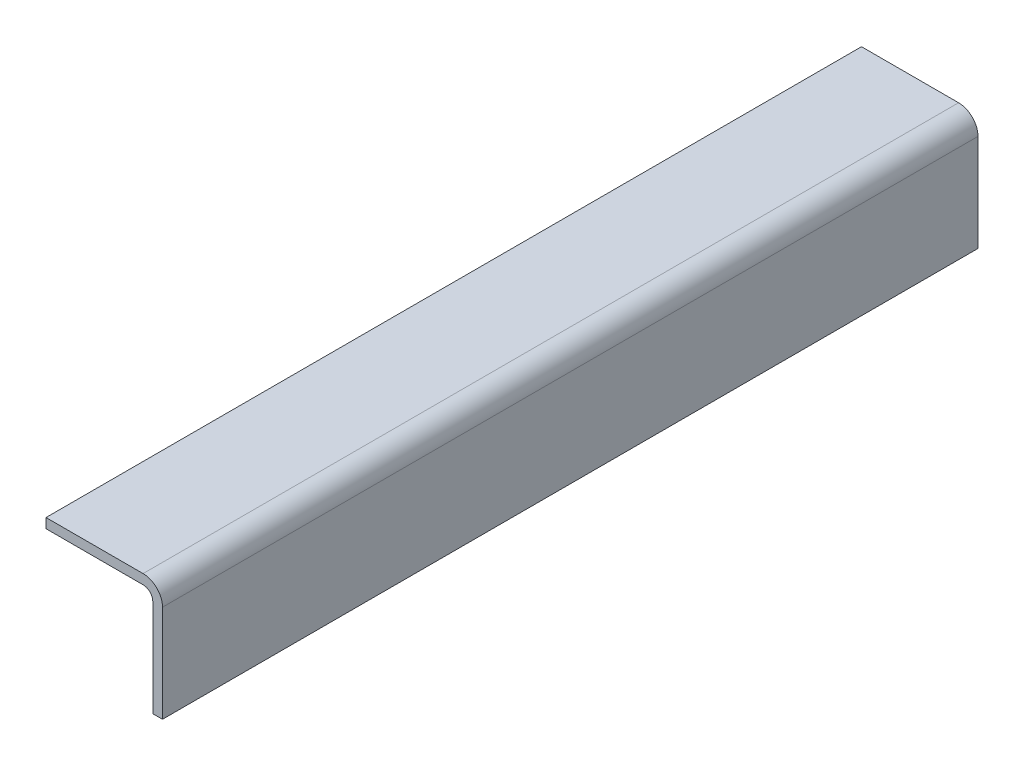
ISO-10303-21;
HEADER;
FILE_DESCRIPTION(('STEP AP214'),'2;1');
FILE_NAME('part.step','',(''),(''),'','','');
FILE_SCHEMA(('AUTOMOTIVE_DESIGN { 1 0 10303 214 1 1 1 1 }'));
ENDSEC;
DATA;
#1=APPLICATION_CONTEXT('core data for automotive mechanical design processes');
#2=APPLICATION_PROTOCOL_DEFINITION('international standard','automotive_design',2000,#1);
#3=PRODUCT_CONTEXT('',#1,'mechanical');
#4=PRODUCT('Part','Part','',(#3));
#5=PRODUCT_RELATED_PRODUCT_CATEGORY('part','',(#4));
#6=PRODUCT_DEFINITION_FORMATION('','',#4);
#7=PRODUCT_DEFINITION_CONTEXT('part definition',#1,'design');
#8=PRODUCT_DEFINITION('design','',#6,#7);
#9=PRODUCT_DEFINITION_SHAPE('','',#8);
#10=(LENGTH_UNIT() NAMED_UNIT(*) SI_UNIT(.MILLI.,.METRE.));
#11=(NAMED_UNIT(*) PLANE_ANGLE_UNIT() SI_UNIT($,.RADIAN.));
#12=(NAMED_UNIT(*) SI_UNIT($,.STERADIAN.) SOLID_ANGLE_UNIT());
#13=UNCERTAINTY_MEASURE_WITH_UNIT(LENGTH_MEASURE(1.E-05),#10,'distance_accuracy_value','');
#14=(GEOMETRIC_REPRESENTATION_CONTEXT(3) GLOBAL_UNCERTAINTY_ASSIGNED_CONTEXT((#13)) GLOBAL_UNIT_ASSIGNED_CONTEXT((#10,
#11,#12)) REPRESENTATION_CONTEXT('',''));
#15=CARTESIAN_POINT('',(0.,0.,0.));
#16=DIRECTION('',(0.,0.,1.));
#17=DIRECTION('',(1.,0.,0.));
#18=AXIS2_PLACEMENT_3D('',#15,#16,#17);
#19=CARTESIAN_POINT('',(0.,38.1,133.35));
#20=DIRECTION('',(0.,1.,0.));
#21=DIRECTION('',(0.,0.,1.));
#22=AXIS2_PLACEMENT_3D('',#19,#20,#21);
#23=PLANE('',#22);
#24=DIRECTION('',(1.,0.,0.));
#25=VECTOR('',#24,1.);
#26=CARTESIAN_POINT('',(0.,38.1,133.35));
#27=LINE('',#26,#25);
#28=CARTESIAN_POINT('',(-38.1,38.1,133.35));
#29=VERTEX_POINT('',#28);
#30=CARTESIAN_POINT('',(-6.35,38.1,133.35));
#31=VERTEX_POINT('',#30);
#32=EDGE_CURVE('E104',#29,#31,#27,.T.);
#33=ORIENTED_EDGE('',*,*,#32,.T.);
#34=DIRECTION('',(0.,0.,-1.));
#35=VECTOR('',#34,1.);
#36=CARTESIAN_POINT('',(-6.35,38.1,133.35));
#37=LINE('',#36,#35);
#38=CARTESIAN_POINT('',(-6.35,38.1,-133.35));
#39=VERTEX_POINT('',#38);
#40=EDGE_CURVE('E163',#31,#39,#37,.T.);
#41=ORIENTED_EDGE('',*,*,#40,.T.);
#42=DIRECTION('',(1.,0.,0.));
#43=VECTOR('',#42,1.);
#44=CARTESIAN_POINT('',(0.,38.1,-133.35));
#45=LINE('',#44,#43);
#46=CARTESIAN_POINT('',(-38.1,38.1,-133.35));
#47=VERTEX_POINT('',#46);
#48=EDGE_CURVE('E106',#47,#39,#45,.T.);
#49=ORIENTED_EDGE('',*,*,#48,.F.);
#50=DIRECTION('',(0.,0.,-1.));
#51=VECTOR('',#50,1.);
#52=CARTESIAN_POINT('',(-38.1,38.1,133.35));
#53=LINE('',#52,#51);
#54=EDGE_CURVE('E101',#29,#47,#53,.T.);
#55=ORIENTED_EDGE('',*,*,#54,.F.);
#56=EDGE_LOOP('',(#33,#41,#49,#55));
#57=FACE_BOUND('',#56,.T.);
#58=ADVANCED_FACE('F38',(#57),#23,.T.);
#59=CARTESIAN_POINT('',(-38.1,0.,133.35));
#60=DIRECTION('',(-1.,0.,0.));
#61=DIRECTION('',(0.,0.,1.));
#62=AXIS2_PLACEMENT_3D('',#59,#60,#61);
#63=PLANE('',#62);
#64=DIRECTION('',(0.,1.,0.));
#65=VECTOR('',#64,1.);
#66=CARTESIAN_POINT('',(-38.1,0.,-133.35));
#67=LINE('',#66,#65);
#68=CARTESIAN_POINT('',(-38.1,34.925,-133.35));
#69=VERTEX_POINT('',#68);
#70=EDGE_CURVE('E139',#69,#47,#67,.T.);
#71=ORIENTED_EDGE('',*,*,#70,.F.);
#72=DIRECTION('',(0.,0.,-1.));
#73=VECTOR('',#72,1.);
#74=CARTESIAN_POINT('',(-38.1,34.925,133.35));
#75=LINE('',#74,#73);
#76=CARTESIAN_POINT('',(-38.1,34.925,133.35));
#77=VERTEX_POINT('',#76);
#78=EDGE_CURVE('E112',#77,#69,#75,.T.);
#79=ORIENTED_EDGE('',*,*,#78,.F.);
#80=DIRECTION('',(0.,1.,0.));
#81=VECTOR('',#80,1.);
#82=CARTESIAN_POINT('',(-38.1,0.,133.35));
#83=LINE('',#82,#81);
#84=EDGE_CURVE('E118',#77,#29,#83,.T.);
#85=ORIENTED_EDGE('',*,*,#84,.T.);
#86=ORIENTED_EDGE('',*,*,#54,.T.);
#87=EDGE_LOOP('',(#71,#79,#85,#86));
#88=FACE_BOUND('',#87,.T.);
#89=ADVANCED_FACE('F123',(#88),#63,.T.);
#90=CARTESIAN_POINT('',(0.,34.925,133.35));
#91=DIRECTION('',(0.,-1.,0.));
#92=DIRECTION('',(0.,0.,-1.));
#93=AXIS2_PLACEMENT_3D('',#90,#91,#92);
#94=PLANE('',#93);
#95=DIRECTION('',(-1.,0.,0.));
#96=VECTOR('',#95,1.);
#97=CARTESIAN_POINT('',(0.,34.925,-133.35));
#98=LINE('',#97,#96);
#99=CARTESIAN_POINT('',(-6.35,34.925,-133.35));
#100=VERTEX_POINT('',#99);
#101=EDGE_CURVE('E141',#100,#69,#98,.T.);
#102=ORIENTED_EDGE('',*,*,#101,.F.);
#103=DIRECTION('',(0.,0.,-1.));
#104=VECTOR('',#103,1.);
#105=CARTESIAN_POINT('',(-6.35,34.925,133.35));
#106=LINE('',#105,#104);
#107=CARTESIAN_POINT('',(-6.35,34.925,133.35));
#108=VERTEX_POINT('',#107);
#109=EDGE_CURVE('E157',#100,#108,#106,.F.);
#110=ORIENTED_EDGE('',*,*,#109,.T.);
#111=DIRECTION('',(-1.,0.,0.));
#112=VECTOR('',#111,1.);
#113=CARTESIAN_POINT('',(0.,34.925,133.35));
#114=LINE('',#113,#112);
#115=EDGE_CURVE('E125',#108,#77,#114,.T.);
#116=ORIENTED_EDGE('',*,*,#115,.T.);
#117=ORIENTED_EDGE('',*,*,#78,.T.);
#118=EDGE_LOOP('',(#102,#110,#116,#117));
#119=FACE_BOUND('',#118,.T.);
#120=ADVANCED_FACE('F170',(#119),#94,.T.);
#121=CARTESIAN_POINT('',(-3.175,0.,133.35));
#122=DIRECTION('',(-1.,0.,0.));
#123=DIRECTION('',(0.,-1.,0.));
#124=AXIS2_PLACEMENT_3D('',#121,#122,#123);
#125=PLANE('',#124);
#126=DIRECTION('',(0.,1.,0.));
#127=VECTOR('',#126,1.);
#128=CARTESIAN_POINT('',(-3.175,0.,133.35));
#129=LINE('',#128,#127);
#130=CARTESIAN_POINT('',(-3.175,0.,133.35));
#131=VERTEX_POINT('',#130);
#132=CARTESIAN_POINT('',(-3.175,31.75,133.35));
#133=VERTEX_POINT('',#132);
#134=EDGE_CURVE('E127',#131,#133,#129,.T.);
#135=ORIENTED_EDGE('',*,*,#134,.T.);
#136=DIRECTION('',(0.,0.,-1.));
#137=VECTOR('',#136,1.);
#138=CARTESIAN_POINT('',(-3.175,31.75,-133.35));
#139=LINE('',#138,#137);
#140=CARTESIAN_POINT('',(-3.175,31.75,-133.35));
#141=VERTEX_POINT('',#140);
#142=EDGE_CURVE('E111',#133,#141,#139,.T.);
#143=ORIENTED_EDGE('',*,*,#142,.T.);
#144=DIRECTION('',(0.,1.,0.));
#145=VECTOR('',#144,1.);
#146=CARTESIAN_POINT('',(-3.175,0.,-133.35));
#147=LINE('',#146,#145);
#148=CARTESIAN_POINT('',(-3.175,0.,-133.35));
#149=VERTEX_POINT('',#148);
#150=EDGE_CURVE('E143',#149,#141,#147,.T.);
#151=ORIENTED_EDGE('',*,*,#150,.F.);
#152=DIRECTION('',(0.,0.,-1.));
#153=VECTOR('',#152,1.);
#154=CARTESIAN_POINT('',(-3.175,0.,133.35));
#155=LINE('',#154,#153);
#156=EDGE_CURVE('E152',#131,#149,#155,.T.);
#157=ORIENTED_EDGE('',*,*,#156,.F.);
#158=EDGE_LOOP('',(#135,#143,#151,#157));
#159=FACE_BOUND('',#158,.T.);
#160=ADVANCED_FACE('F178',(#159),#125,.T.);
#161=CARTESIAN_POINT('',(0.,0.,133.35));
#162=DIRECTION('',(0.,-1.,0.));
#163=DIRECTION('',(1.,0.,0.));
#164=AXIS2_PLACEMENT_3D('',#161,#162,#163);
#165=PLANE('',#164);
#166=DIRECTION('',(-1.,0.,0.));
#167=VECTOR('',#166,1.);
#168=CARTESIAN_POINT('',(0.,0.,-133.35));
#169=LINE('',#168,#167);
#170=CARTESIAN_POINT('',(0.,0.,-133.35));
#171=VERTEX_POINT('',#170);
#172=EDGE_CURVE('E146',#171,#149,#169,.T.);
#173=ORIENTED_EDGE('',*,*,#172,.F.);
#174=DIRECTION('',(0.,0.,-1.));
#175=VECTOR('',#174,1.);
#176=CARTESIAN_POINT('',(0.,0.,133.35));
#177=LINE('',#176,#175);
#178=CARTESIAN_POINT('',(0.,0.,133.35));
#179=VERTEX_POINT('',#178);
#180=EDGE_CURVE('E137',#179,#171,#177,.T.);
#181=ORIENTED_EDGE('',*,*,#180,.F.);
#182=DIRECTION('',(-1.,0.,0.));
#183=VECTOR('',#182,1.);
#184=CARTESIAN_POINT('',(0.,0.,133.35));
#185=LINE('',#184,#183);
#186=EDGE_CURVE('E132',#179,#131,#185,.T.);
#187=ORIENTED_EDGE('',*,*,#186,.T.);
#188=ORIENTED_EDGE('',*,*,#156,.T.);
#189=EDGE_LOOP('',(#173,#181,#187,#188));
#190=FACE_BOUND('',#189,.T.);
#191=ADVANCED_FACE('F182',(#190),#165,.T.);
#192=CARTESIAN_POINT('',(0.,0.,133.35));
#193=DIRECTION('',(1.,0.,0.));
#194=DIRECTION('',(0.,1.,0.));
#195=AXIS2_PLACEMENT_3D('',#192,#193,#194);
#196=PLANE('',#195);
#197=DIRECTION('',(0.,-1.,0.));
#198=VECTOR('',#197,1.);
#199=CARTESIAN_POINT('',(0.,0.,-133.35));
#200=LINE('',#199,#198);
#201=CARTESIAN_POINT('',(0.,31.75,-133.35));
#202=VERTEX_POINT('',#201);
#203=EDGE_CURVE('E120',#202,#171,#200,.T.);
#204=ORIENTED_EDGE('',*,*,#203,.F.);
#205=DIRECTION('',(0.,0.,-1.));
#206=VECTOR('',#205,1.);
#207=CARTESIAN_POINT('',(0.,31.75,133.35));
#208=LINE('',#207,#206);
#209=CARTESIAN_POINT('',(0.,31.75,133.35));
#210=VERTEX_POINT('',#209);
#211=EDGE_CURVE('E46',#202,#210,#208,.F.);
#212=ORIENTED_EDGE('',*,*,#211,.T.);
#213=DIRECTION('',(0.,-1.,0.));
#214=VECTOR('',#213,1.);
#215=CARTESIAN_POINT('',(0.,0.,133.35));
#216=LINE('',#215,#214);
#217=EDGE_CURVE('E135',#210,#179,#216,.T.);
#218=ORIENTED_EDGE('',*,*,#217,.T.);
#219=ORIENTED_EDGE('',*,*,#180,.T.);
#220=EDGE_LOOP('',(#204,#212,#218,#219));
#221=FACE_BOUND('',#220,.T.);
#222=ADVANCED_FACE('F201',(#221),#196,.T.);
#223=CARTESIAN_POINT('',(0.,0.,133.35));
#224=DIRECTION('',(0.,0.,1.));
#225=DIRECTION('',(1.,0.,0.));
#226=AXIS2_PLACEMENT_3D('',#223,#224,#225);
#227=PLANE('',#226);
#228=ORIENTED_EDGE('',*,*,#217,.F.);
#229=CARTESIAN_POINT('',(-6.35,31.75,133.35));
#230=DIRECTION('',(0.,0.,1.));
#231=DIRECTION('',(1.,0.,0.));
#232=AXIS2_PLACEMENT_3D('',#229,#230,#231);
#233=CIRCLE('',#232,6.35);
#234=EDGE_CURVE('E11',#210,#31,#233,.T.);
#235=ORIENTED_EDGE('',*,*,#234,.T.);
#236=ORIENTED_EDGE('',*,*,#32,.F.);
#237=ORIENTED_EDGE('',*,*,#84,.F.);
#238=ORIENTED_EDGE('',*,*,#115,.F.);
#239=CARTESIAN_POINT('',(-6.35,31.75,133.35));
#240=DIRECTION('',(0.,0.,1.));
#241=DIRECTION('',(1.,0.,0.));
#242=AXIS2_PLACEMENT_3D('',#239,#240,#241);
#243=CIRCLE('',#242,3.175);
#244=EDGE_CURVE('E161',#108,#133,#243,.F.);
#245=ORIENTED_EDGE('',*,*,#244,.T.);
#246=ORIENTED_EDGE('',*,*,#134,.F.);
#247=ORIENTED_EDGE('',*,*,#186,.F.);
#248=EDGE_LOOP('',(#228,#235,#236,#237,#238,#245,#246,#247));
#249=FACE_BOUND('',#248,.T.);
#250=ADVANCED_FACE('F116',(#249),#227,.T.);
#251=CARTESIAN_POINT('',(0.,0.,-133.35));
#252=DIRECTION('',(0.,0.,1.));
#253=DIRECTION('',(1.,0.,0.));
#254=AXIS2_PLACEMENT_3D('',#251,#252,#253);
#255=PLANE('',#254);
#256=ORIENTED_EDGE('',*,*,#48,.T.);
#257=CARTESIAN_POINT('',(-6.35,31.75,-133.35));
#258=DIRECTION('',(0.,0.,1.));
#259=DIRECTION('',(1.,0.,0.));
#260=AXIS2_PLACEMENT_3D('',#257,#258,#259);
#261=CIRCLE('',#260,6.35);
#262=EDGE_CURVE('E60',#39,#202,#261,.F.);
#263=ORIENTED_EDGE('',*,*,#262,.T.);
#264=ORIENTED_EDGE('',*,*,#203,.T.);
#265=ORIENTED_EDGE('',*,*,#172,.T.);
#266=ORIENTED_EDGE('',*,*,#150,.T.);
#267=CARTESIAN_POINT('',(-6.35,31.75,-133.35));
#268=DIRECTION('',(0.,0.,1.));
#269=DIRECTION('',(1.,0.,0.));
#270=AXIS2_PLACEMENT_3D('',#267,#268,#269);
#271=CIRCLE('',#270,3.175);
#272=EDGE_CURVE('E159',#141,#100,#271,.T.);
#273=ORIENTED_EDGE('',*,*,#272,.T.);
#274=ORIENTED_EDGE('',*,*,#101,.T.);
#275=ORIENTED_EDGE('',*,*,#70,.T.);
#276=EDGE_LOOP('',(#256,#263,#264,#265,#266,#273,#274,#275));
#277=FACE_BOUND('',#276,.T.);
#278=ADVANCED_FACE('F166',(#277),#255,.F.);
#279=CARTESIAN_POINT('',(-6.35,31.75,133.35));
#280=DIRECTION('',(0.,0.,1.));
#281=DIRECTION('',(1.,0.,0.));
#282=AXIS2_PLACEMENT_3D('',#279,#280,#281);
#283=CYLINDRICAL_SURFACE('',#282,3.175);
#284=ORIENTED_EDGE('',*,*,#244,.F.);
#285=ORIENTED_EDGE('',*,*,#109,.F.);
#286=ORIENTED_EDGE('',*,*,#272,.F.);
#287=ORIENTED_EDGE('',*,*,#142,.F.);
#288=EDGE_LOOP('',(#284,#285,#286,#287));
#289=FACE_BOUND('',#288,.T.);
#290=ADVANCED_FACE('F175',(#289),#283,.F.);
#291=CARTESIAN_POINT('',(-6.35,31.75,133.35));
#292=DIRECTION('',(0.,0.,-1.));
#293=DIRECTION('',(-1.,0.,0.));
#294=AXIS2_PLACEMENT_3D('',#291,#292,#293);
#295=CYLINDRICAL_SURFACE('',#294,6.35);
#296=ORIENTED_EDGE('',*,*,#234,.F.);
#297=ORIENTED_EDGE('',*,*,#211,.F.);
#298=ORIENTED_EDGE('',*,*,#262,.F.);
#299=ORIENTED_EDGE('',*,*,#40,.F.);
#300=EDGE_LOOP('',(#296,#297,#298,#299));
#301=FACE_BOUND('',#300,.T.);
#302=ADVANCED_FACE('F40',(#301),#295,.T.);
#303=CLOSED_SHELL('',(#58,#89,#120,#160,#191,#222,#250,#278,#290,#302));
#304=MANIFOLD_SOLID_BREP('B2',#303);
#305=ADVANCED_BREP_SHAPE_REPRESENTATION('',(#18,#304),#14);
#306=SHAPE_DEFINITION_REPRESENTATION(#9,#305);
ENDSEC;
END-ISO-10303-21;
